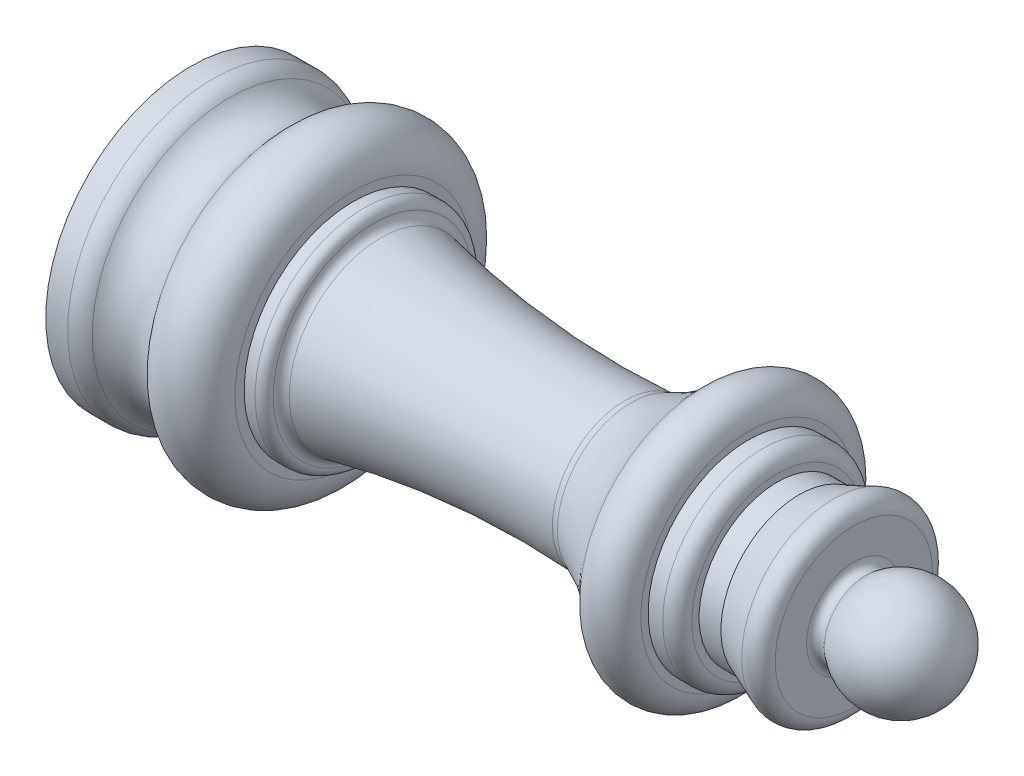
ISO-10303-21;
HEADER;
FILE_DESCRIPTION(('STEP AP214'),'2;1');
FILE_NAME('part.step','',(''),(''),'','','');
FILE_SCHEMA(('AUTOMOTIVE_DESIGN { 1 0 10303 214 1 1 1 1 }'));
ENDSEC;
DATA;
#1=APPLICATION_CONTEXT('core data for automotive mechanical design processes');
#2=APPLICATION_PROTOCOL_DEFINITION('international standard','automotive_design',2000,#1);
#3=PRODUCT_CONTEXT('',#1,'mechanical');
#4=PRODUCT('Part','Part','',(#3));
#5=PRODUCT_RELATED_PRODUCT_CATEGORY('part','',(#4));
#6=PRODUCT_DEFINITION_FORMATION('','',#4);
#7=PRODUCT_DEFINITION_CONTEXT('part definition',#1,'design');
#8=PRODUCT_DEFINITION('design','',#6,#7);
#9=PRODUCT_DEFINITION_SHAPE('','',#8);
#10=(LENGTH_UNIT() NAMED_UNIT(*) SI_UNIT(.MILLI.,.METRE.));
#11=(NAMED_UNIT(*) PLANE_ANGLE_UNIT() SI_UNIT($,.RADIAN.));
#12=(NAMED_UNIT(*) SI_UNIT($,.STERADIAN.) SOLID_ANGLE_UNIT());
#13=UNCERTAINTY_MEASURE_WITH_UNIT(LENGTH_MEASURE(1.E-05),#10,'distance_accuracy_value','');
#14=(GEOMETRIC_REPRESENTATION_CONTEXT(3) GLOBAL_UNCERTAINTY_ASSIGNED_CONTEXT((#13)) GLOBAL_UNIT_ASSIGNED_CONTEXT((#10,
#11,#12)) REPRESENTATION_CONTEXT('',''));
#15=CARTESIAN_POINT('',(0.,0.,0.));
#16=DIRECTION('',(0.,0.,1.));
#17=DIRECTION('',(1.,0.,0.));
#18=AXIS2_PLACEMENT_3D('',#15,#16,#17);
#19=CARTESIAN_POINT('',(-7.5,0.,0.));
#20=DIRECTION('',(1.,0.,0.));
#21=DIRECTION('',(0.,1.,0.));
#22=AXIS2_PLACEMENT_3D('',#19,#20,#21);
#23=SPHERICAL_SURFACE('',#22,7.5);
#24=CARTESIAN_POINT('',(-12.3529411764706,0.,0.));
#25=DIRECTION('',(1.,0.,0.));
#26=DIRECTION('',(0.,0.,-1.));
#27=AXIS2_PLACEMENT_3D('',#24,#25,#26);
#28=CIRCLE('',#27,5.71830061624223);
#29=CARTESIAN_POINT('',(-12.3529411764706,0.,-5.71830061624223));
#30=VERTEX_POINT('',#29);
#31=EDGE_CURVE('E59',#30,#30,#28,.T.);
#32=ORIENTED_EDGE('',*,*,#31,.T.);
#33=EDGE_LOOP('',(#32));
#34=FACE_BOUND('',#33,.T.);
#35=ADVANCED_FACE('F33',(#34),#23,.T.);
#36=CARTESIAN_POINT('',(-13.,0.,0.));
#37=DIRECTION('',(1.,0.,0.));
#38=DIRECTION('',(0.,0.,-1.));
#39=AXIS2_PLACEMENT_3D('',#36,#37,#38);
#40=TOROIDAL_SURFACE('',#39,6.48074069840786,1.);
#41=CARTESIAN_POINT('',(-14.,0.,0.));
#42=DIRECTION('',(1.,0.,0.));
#43=DIRECTION('',(0.,0.,-1.));
#44=AXIS2_PLACEMENT_3D('',#41,#42,#43);
#45=CIRCLE('',#44,6.48074069840786);
#46=CARTESIAN_POINT('',(-14.,0.,-6.48074069840786));
#47=VERTEX_POINT('',#46);
#48=EDGE_CURVE('E62',#47,#47,#45,.T.);
#49=ORIENTED_EDGE('',*,*,#48,.T.);
#50=EDGE_LOOP('',(#49));
#51=FACE_BOUND('',#50,.T.);
#52=ORIENTED_EDGE('',*,*,#31,.F.);
#53=EDGE_LOOP('',(#52));
#54=FACE_BOUND('',#53,.T.);
#55=ADVANCED_FACE('F125',(#51,#54),#40,.F.);
#56=CARTESIAN_POINT('',(-14.,6.48074069840786,0.));
#57=DIRECTION('',(1.,0.,0.));
#58=DIRECTION('',(0.,0.,-1.));
#59=AXIS2_PLACEMENT_3D('',#56,#57,#58);
#60=PLANE('',#59);
#61=CARTESIAN_POINT('',(-14.,0.,0.));
#62=DIRECTION('',(1.,0.,0.));
#63=DIRECTION('',(0.,0.,-1.));
#64=AXIS2_PLACEMENT_3D('',#61,#62,#63);
#65=CIRCLE('',#64,10.7959340771462);
#66=CARTESIAN_POINT('',(-14.,0.,-10.7959340771462));
#67=VERTEX_POINT('',#66);
#68=EDGE_CURVE('E48',#67,#67,#65,.T.);
#69=ORIENTED_EDGE('',*,*,#68,.T.);
#70=EDGE_LOOP('',(#69));
#71=FACE_BOUND('',#70,.T.);
#72=ORIENTED_EDGE('',*,*,#48,.F.);
#73=EDGE_LOOP('',(#72));
#74=FACE_BOUND('',#73,.T.);
#75=ADVANCED_FACE('F131',(#71,#74),#60,.T.);
#76=CARTESIAN_POINT('',(-14.,0.,0.));
#77=DIRECTION('',(1.,0.,0.));
#78=DIRECTION('',(0.,0.,-1.));
#79=AXIS2_PLACEMENT_3D('',#76,#77,#78);
#80=CONICAL_SURFACE('',#79,13.75,0.380506377112365);
#81=CARTESIAN_POINT('',(-16.7427813527082,0.,0.));
#82=DIRECTION('',(-1.,0.,0.));
#83=DIRECTION('',(0.,0.,1.));
#84=AXIS2_PLACEMENT_3D('',#81,#82,#83);
#85=CIRCLE('',#84,12.6528874589167);
#86=CARTESIAN_POINT('',(-16.7427813527082,0.,12.6528874589167));
#87=VERTEX_POINT('',#86);
#88=EDGE_CURVE('E44',#87,#87,#85,.T.);
#89=ORIENTED_EDGE('',*,*,#88,.T.);
#90=EDGE_LOOP('',(#89));
#91=FACE_BOUND('',#90,.T.);
#92=CARTESIAN_POINT('',(-21.5,0.,0.));
#93=DIRECTION('',(1.,0.,0.));
#94=DIRECTION('',(0.,0.,-1.));
#95=AXIS2_PLACEMENT_3D('',#92,#93,#94);
#96=CIRCLE('',#95,10.75);
#97=CARTESIAN_POINT('',(-21.5,0.,-10.75));
#98=VERTEX_POINT('',#97);
#99=EDGE_CURVE('E65',#98,#98,#96,.T.);
#100=ORIENTED_EDGE('',*,*,#99,.T.);
#101=EDGE_LOOP('',(#100));
#102=FACE_BOUND('',#101,.T.);
#103=ADVANCED_FACE('F147',(#91,#102),#80,.T.);
#104=CARTESIAN_POINT('',(0.,0.,0.));
#105=DIRECTION('',(1.,0.,0.));
#106=DIRECTION('',(0.,0.,-1.));
#107=AXIS2_PLACEMENT_3D('',#104,#105,#106);
#108=CYLINDRICAL_SURFACE('',#107,10.75);
#109=CARTESIAN_POINT('',(-24.5,0.,0.));
#110=DIRECTION('',(1.,0.,0.));
#111=DIRECTION('',(0.,0.,-1.));
#112=AXIS2_PLACEMENT_3D('',#109,#110,#111);
#113=CIRCLE('',#112,10.75);
#114=CARTESIAN_POINT('',(-24.5,0.,-10.75));
#115=VERTEX_POINT('',#114);
#116=EDGE_CURVE('E68',#115,#115,#113,.T.);
#117=ORIENTED_EDGE('',*,*,#116,.T.);
#118=EDGE_LOOP('',(#117));
#119=FACE_BOUND('',#118,.T.);
#120=ORIENTED_EDGE('',*,*,#99,.F.);
#121=EDGE_LOOP('',(#120));
#122=FACE_BOUND('',#121,.T.);
#123=ADVANCED_FACE('F154',(#119,#122),#108,.T.);
#124=CARTESIAN_POINT('',(-24.5,10.75,0.));
#125=DIRECTION('',(1.,0.,0.));
#126=DIRECTION('',(0.,0.,-1.));
#127=AXIS2_PLACEMENT_3D('',#124,#125,#126);
#128=PLANE('',#127);
#129=CARTESIAN_POINT('',(-24.5,0.,0.));
#130=DIRECTION('',(1.,0.,0.));
#131=DIRECTION('',(0.,0.,-1.));
#132=AXIS2_PLACEMENT_3D('',#129,#130,#131);
#133=CIRCLE('',#132,11.75);
#134=CARTESIAN_POINT('',(-24.5,0.,-11.75));
#135=VERTEX_POINT('',#134);
#136=EDGE_CURVE('E56',#135,#135,#133,.T.);
#137=ORIENTED_EDGE('',*,*,#136,.T.);
#138=EDGE_LOOP('',(#137));
#139=FACE_BOUND('',#138,.T.);
#140=ORIENTED_EDGE('',*,*,#116,.F.);
#141=EDGE_LOOP('',(#140));
#142=FACE_BOUND('',#141,.T.);
#143=ADVANCED_FACE('F160',(#139,#142),#128,.T.);
#144=CARTESIAN_POINT('',(0.,0.,0.));
#145=DIRECTION('',(1.,0.,0.));
#146=DIRECTION('',(0.,0.,-1.));
#147=AXIS2_PLACEMENT_3D('',#144,#145,#146);
#148=CYLINDRICAL_SURFACE('',#147,13.75);
#149=CARTESIAN_POINT('',(-26.5,0.,0.));
#150=DIRECTION('',(1.,0.,0.));
#151=DIRECTION('',(0.,0.,-1.));
#152=AXIS2_PLACEMENT_3D('',#149,#150,#151);
#153=CIRCLE('',#152,13.75);
#154=CARTESIAN_POINT('',(-26.5,0.,-13.75));
#155=VERTEX_POINT('',#154);
#156=EDGE_CURVE('E53',#155,#155,#153,.F.);
#157=ORIENTED_EDGE('',*,*,#156,.T.);
#158=EDGE_LOOP('',(#157));
#159=FACE_BOUND('',#158,.T.);
#160=CARTESIAN_POINT('',(-28.5,0.,0.));
#161=DIRECTION('',(1.,0.,0.));
#162=DIRECTION('',(0.,0.,-1.));
#163=AXIS2_PLACEMENT_3D('',#160,#161,#162);
#164=CIRCLE('',#163,13.75);
#165=CARTESIAN_POINT('',(-28.5,0.,-13.75));
#166=VERTEX_POINT('',#165);
#167=EDGE_CURVE('E71',#166,#166,#164,.T.);
#168=ORIENTED_EDGE('',*,*,#167,.T.);
#169=EDGE_LOOP('',(#168));
#170=FACE_BOUND('',#169,.T.);
#171=ADVANCED_FACE('F164',(#159,#170),#148,.T.);
#172=CARTESIAN_POINT('',(-28.5,13.75,0.));
#173=DIRECTION('',(1.,0.,0.));
#174=DIRECTION('',(0.,0.,-1.));
#175=AXIS2_PLACEMENT_3D('',#172,#173,#174);
#176=PLANE('',#175);
#177=CARTESIAN_POINT('',(-28.5,0.,0.));
#178=DIRECTION('',(1.,0.,0.));
#179=DIRECTION('',(0.,0.,-1.));
#180=AXIS2_PLACEMENT_3D('',#177,#178,#179);
#181=CIRCLE('',#180,14.75);
#182=CARTESIAN_POINT('',(-28.5,0.,-14.75));
#183=VERTEX_POINT('',#182);
#184=EDGE_CURVE('E74',#183,#183,#181,.T.);
#185=ORIENTED_EDGE('',*,*,#184,.T.);
#186=EDGE_LOOP('',(#185));
#187=FACE_BOUND('',#186,.T.);
#188=ORIENTED_EDGE('',*,*,#167,.F.);
#189=EDGE_LOOP('',(#188));
#190=FACE_BOUND('',#189,.T.);
#191=ADVANCED_FACE('F168',(#187,#190),#176,.T.);
#192=CARTESIAN_POINT('',(-31.9998435285759,0.,0.));
#193=DIRECTION('',(1.,0.,0.));
#194=DIRECTION('',(0.,0.,-1.));
#195=AXIS2_PLACEMENT_3D('',#192,#193,#194);
#196=TOROIDAL_SURFACE('',#195,14.7169050534756,3.49999999999999);
#197=CARTESIAN_POINT('',(-34.637471585637,0.,0.));
#198=DIRECTION('',(1.,0.,0.));
#199=DIRECTION('',(0.,0.,-1.));
#200=AXIS2_PLACEMENT_3D('',#197,#198,#199);
#201=CIRCLE('',#200,17.0175393644003);
#202=CARTESIAN_POINT('',(-34.637471585637,0.,-17.0175393644003));
#203=VERTEX_POINT('',#202);
#204=EDGE_CURVE('E77',#203,#203,#201,.T.);
#205=ORIENTED_EDGE('',*,*,#204,.T.);
#206=EDGE_LOOP('',(#205));
#207=FACE_BOUND('',#206,.T.);
#208=ORIENTED_EDGE('',*,*,#184,.F.);
#209=EDGE_LOOP('',(#208));
#210=FACE_BOUND('',#209,.T.);
#211=ADVANCED_FACE('F172',(#207,#210),#196,.T.);
#212=CARTESIAN_POINT('',(-53.1008679850651,0.,0.));
#213=DIRECTION('',(1.,0.,0.));
#214=DIRECTION('',(0.,0.,-1.));
#215=AXIS2_PLACEMENT_3D('',#212,#213,#214);
#216=TOROIDAL_SURFACE('',#215,33.1219795408729,24.5);
#217=CARTESIAN_POINT('',(-44.5676192443092,0.,0.));
#218=DIRECTION('',(-1.,0.,0.));
#219=DIRECTION('',(0.,0.,1.));
#220=AXIS2_PLACEMENT_3D('',#217,#218,#219);
#221=CIRCLE('',#220,10.156055524444);
#222=CARTESIAN_POINT('',(-44.5676192443092,0.,10.156055524444));
#223=VERTEX_POINT('',#222);
#224=EDGE_CURVE('E40',#223,#223,#221,.F.);
#225=ORIENTED_EDGE('',*,*,#224,.T.);
#226=EDGE_LOOP('',(#225));
#227=FACE_BOUND('',#226,.T.);
#228=ORIENTED_EDGE('',*,*,#204,.F.);
#229=EDGE_LOOP('',(#228));
#230=FACE_BOUND('',#229,.T.);
#231=ADVANCED_FACE('F176',(#227,#230),#216,.F.);
#232=CARTESIAN_POINT('',(-52.8281884760566,0.,0.));
#233=DIRECTION('',(1.,0.,0.));
#234=DIRECTION('',(0.,0.,-1.));
#235=AXIS2_PLACEMENT_3D('',#232,#233,#234);
#236=TOROIDAL_SURFACE('',#235,134.754637048822,125.);
#237=CARTESIAN_POINT('',(-45.4350720510171,0.,0.));
#238=DIRECTION('',(-1.,0.,0.));
#239=DIRECTION('',(0.,0.,1.));
#240=AXIS2_PLACEMENT_3D('',#237,#238,#239);
#241=CIRCLE('',#240,9.97346126687247);
#242=CARTESIAN_POINT('',(-45.4350720510171,0.,9.97346126687247));
#243=VERTEX_POINT('',#242);
#244=EDGE_CURVE('E10',#243,#243,#241,.T.);
#245=ORIENTED_EDGE('',*,*,#244,.T.);
#246=EDGE_LOOP('',(#245));
#247=FACE_BOUND('',#246,.T.);
#248=CARTESIAN_POINT('',(-79.0118364800399,0.,0.));
#249=DIRECTION('',(1.,0.,0.));
#250=DIRECTION('',(0.,0.,-1.));
#251=AXIS2_PLACEMENT_3D('',#248,#249,#250);
#252=CIRCLE('',#251,12.5277309389008);
#253=CARTESIAN_POINT('',(-79.0118364800399,0.,-12.5277309389008));
#254=VERTEX_POINT('',#253);
#255=EDGE_CURVE('E80',#254,#254,#252,.T.);
#256=ORIENTED_EDGE('',*,*,#255,.T.);
#257=EDGE_LOOP('',(#256));
#258=FACE_BOUND('',#257,.T.);
#259=ADVANCED_FACE('F180',(#247,#258),#236,.F.);
#260=CARTESIAN_POINT('',(-78.7500000000001,0.,0.));
#261=DIRECTION('',(1.,0.,0.));
#262=DIRECTION('',(0.,0.,-1.));
#263=AXIS2_PLACEMENT_3D('',#260,#261,#262);
#264=TOROIDAL_SURFACE('',#263,13.75,1.24999999999995);
#265=CARTESIAN_POINT('',(-80.0000000000001,0.,0.));
#266=DIRECTION('',(1.,0.,0.));
#267=DIRECTION('',(0.,0.,-1.));
#268=AXIS2_PLACEMENT_3D('',#265,#266,#267);
#269=CIRCLE('',#268,13.75);
#270=CARTESIAN_POINT('',(-80.0000000000001,0.,-13.75));
#271=VERTEX_POINT('',#270);
#272=EDGE_CURVE('E83',#271,#271,#269,.T.);
#273=ORIENTED_EDGE('',*,*,#272,.T.);
#274=EDGE_LOOP('',(#273));
#275=FACE_BOUND('',#274,.T.);
#276=ORIENTED_EDGE('',*,*,#255,.F.);
#277=EDGE_LOOP('',(#276));
#278=FACE_BOUND('',#277,.T.);
#279=ADVANCED_FACE('F183',(#275,#278),#264,.F.);
#280=CARTESIAN_POINT('',(-81.2500000000001,0.,0.));
#281=DIRECTION('',(1.,0.,0.));
#282=DIRECTION('',(0.,0.,-1.));
#283=AXIS2_PLACEMENT_3D('',#280,#281,#282);
#284=TOROIDAL_SURFACE('',#283,13.75,1.25);
#285=CARTESIAN_POINT('',(-81.2500000000001,0.,0.));
#286=DIRECTION('',(1.,0.,0.));
#287=DIRECTION('',(0.,0.,-1.));
#288=AXIS2_PLACEMENT_3D('',#285,#286,#287);
#289=CIRCLE('',#288,15.);
#290=CARTESIAN_POINT('',(-81.2500000000001,0.,-15.));
#291=VERTEX_POINT('',#290);
#292=EDGE_CURVE('E86',#291,#291,#289,.T.);
#293=ORIENTED_EDGE('',*,*,#292,.T.);
#294=EDGE_LOOP('',(#293));
#295=FACE_BOUND('',#294,.T.);
#296=ORIENTED_EDGE('',*,*,#272,.F.);
#297=EDGE_LOOP('',(#296));
#298=FACE_BOUND('',#297,.T.);
#299=ADVANCED_FACE('F186',(#295,#298),#284,.T.);
#300=CARTESIAN_POINT('',(0.,0.,0.));
#301=DIRECTION('',(1.,0.,0.));
#302=DIRECTION('',(0.,0.,-1.));
#303=AXIS2_PLACEMENT_3D('',#300,#301,#302);
#304=CYLINDRICAL_SURFACE('',#303,15.);
#305=CARTESIAN_POINT('',(-82.7500000000001,0.,0.));
#306=DIRECTION('',(1.,0.,0.));
#307=DIRECTION('',(0.,0.,-1.));
#308=AXIS2_PLACEMENT_3D('',#305,#306,#307);
#309=CIRCLE('',#308,15.);
#310=CARTESIAN_POINT('',(-82.7500000000001,0.,-15.));
#311=VERTEX_POINT('',#310);
#312=EDGE_CURVE('E89',#311,#311,#309,.T.);
#313=ORIENTED_EDGE('',*,*,#312,.T.);
#314=EDGE_LOOP('',(#313));
#315=FACE_BOUND('',#314,.T.);
#316=ORIENTED_EDGE('',*,*,#292,.F.);
#317=EDGE_LOOP('',(#316));
#318=FACE_BOUND('',#317,.T.);
#319=ADVANCED_FACE('F190',(#315,#318),#304,.T.);
#320=CARTESIAN_POINT('',(-82.7500000000001,15.,0.));
#321=DIRECTION('',(1.,0.,0.));
#322=DIRECTION('',(0.,0.,-1.));
#323=AXIS2_PLACEMENT_3D('',#320,#321,#322);
#324=PLANE('',#323);
#325=CARTESIAN_POINT('',(-82.7500000000001,0.,0.));
#326=DIRECTION('',(1.,0.,0.));
#327=DIRECTION('',(0.,0.,-1.));
#328=AXIS2_PLACEMENT_3D('',#325,#326,#327);
#329=CIRCLE('',#328,16.25);
#330=CARTESIAN_POINT('',(-82.7500000000001,0.,-16.25));
#331=VERTEX_POINT('',#330);
#332=EDGE_CURVE('E92',#331,#331,#329,.T.);
#333=ORIENTED_EDGE('',*,*,#332,.T.);
#334=EDGE_LOOP('',(#333));
#335=FACE_BOUND('',#334,.T.);
#336=ORIENTED_EDGE('',*,*,#312,.F.);
#337=EDGE_LOOP('',(#336));
#338=FACE_BOUND('',#337,.T.);
#339=ADVANCED_FACE('F194',(#335,#338),#324,.T.);
#340=CARTESIAN_POINT('',(-87.7500000000001,0.,0.));
#341=DIRECTION('',(1.,0.,0.));
#342=DIRECTION('',(0.,0.,-1.));
#343=AXIS2_PLACEMENT_3D('',#340,#341,#342);
#344=TOROIDAL_SURFACE('',#343,16.25,5.);
#345=CARTESIAN_POINT('',(-91.7995942301947,0.,0.));
#346=DIRECTION('',(1.,0.,0.));
#347=DIRECTION('',(0.,0.,-1.));
#348=AXIS2_PLACEMENT_3D('',#345,#346,#347);
#349=CIRCLE('',#348,19.1827097658606);
#350=CARTESIAN_POINT('',(-91.7995942301947,0.,-19.1827097658606));
#351=VERTEX_POINT('',#350);
#352=EDGE_CURVE('E95',#351,#351,#349,.T.);
#353=ORIENTED_EDGE('',*,*,#352,.T.);
#354=EDGE_LOOP('',(#353));
#355=FACE_BOUND('',#354,.T.);
#356=ORIENTED_EDGE('',*,*,#332,.F.);
#357=EDGE_LOOP('',(#356));
#358=FACE_BOUND('',#357,.T.);
#359=ADVANCED_FACE('F198',(#355,#358),#344,.T.);
#360=CARTESIAN_POINT('',(-95.8491884603894,0.,0.));
#361=DIRECTION('',(1.,0.,0.));
#362=DIRECTION('',(0.,0.,-1.));
#363=AXIS2_PLACEMENT_3D('',#360,#361,#362);
#364=TOROIDAL_SURFACE('',#363,22.1154195317212,5.);
#365=CARTESIAN_POINT('',(-99.6934457075192,0.,0.));
#366=DIRECTION('',(1.,0.,0.));
#367=DIRECTION('',(0.,0.,-1.));
#368=AXIS2_PLACEMENT_3D('',#365,#366,#367);
#369=CIRCLE('',#368,18.9182823407501);
#370=CARTESIAN_POINT('',(-99.6934457075192,0.,-18.9182823407501));
#371=VERTEX_POINT('',#370);
#372=EDGE_CURVE('E98',#371,#371,#369,.T.);
#373=ORIENTED_EDGE('',*,*,#372,.T.);
#374=EDGE_LOOP('',(#373));
#375=FACE_BOUND('',#374,.T.);
#376=ORIENTED_EDGE('',*,*,#352,.F.);
#377=EDGE_LOOP('',(#376));
#378=FACE_BOUND('',#377,.T.);
#379=ADVANCED_FACE('F202',(#375,#378),#364,.F.);
#380=CARTESIAN_POINT('',(-102.,0.,0.));
#381=DIRECTION('',(1.,0.,0.));
#382=DIRECTION('',(0.,0.,-1.));
#383=AXIS2_PLACEMENT_3D('',#380,#381,#382);
#384=TOROIDAL_SURFACE('',#383,17.0000000725719,2.99999992742809);
#385=CARTESIAN_POINT('',(-102.,0.,0.));
#386=DIRECTION('',(1.,0.,0.));
#387=DIRECTION('',(0.,0.,-1.));
#388=AXIS2_PLACEMENT_3D('',#385,#386,#387);
#389=CIRCLE('',#388,20.);
#390=CARTESIAN_POINT('',(-102.,0.,-20.));
#391=VERTEX_POINT('',#390);
#392=EDGE_CURVE('E101',#391,#391,#389,.T.);
#393=ORIENTED_EDGE('',*,*,#392,.T.);
#394=EDGE_LOOP('',(#393));
#395=FACE_BOUND('',#394,.T.);
#396=ORIENTED_EDGE('',*,*,#372,.F.);
#397=EDGE_LOOP('',(#396));
#398=FACE_BOUND('',#397,.T.);
#399=ADVANCED_FACE('F122',(#395,#398),#384,.T.);
#400=CARTESIAN_POINT('',(0.,0.,0.));
#401=DIRECTION('',(1.,0.,0.));
#402=DIRECTION('',(0.,0.,-1.));
#403=AXIS2_PLACEMENT_3D('',#400,#401,#402);
#404=CYLINDRICAL_SURFACE('',#403,20.);
#405=CARTESIAN_POINT('',(-105.,0.,0.));
#406=DIRECTION('',(1.,0.,0.));
#407=DIRECTION('',(0.,0.,-1.));
#408=AXIS2_PLACEMENT_3D('',#405,#406,#407);
#409=CIRCLE('',#408,20.);
#410=CARTESIAN_POINT('',(-105.,0.,-20.));
#411=VERTEX_POINT('',#410);
#412=EDGE_CURVE('E104',#411,#411,#409,.T.);
#413=ORIENTED_EDGE('',*,*,#412,.T.);
#414=EDGE_LOOP('',(#413));
#415=FACE_BOUND('',#414,.T.);
#416=ORIENTED_EDGE('',*,*,#392,.F.);
#417=EDGE_LOOP('',(#416));
#418=FACE_BOUND('',#417,.T.);
#419=ADVANCED_FACE('F108',(#415,#418),#404,.T.);
#420=CARTESIAN_POINT('',(-105.,0.,0.));
#421=DIRECTION('',(-1.,0.,0.));
#422=DIRECTION('',(0.,0.,1.));
#423=AXIS2_PLACEMENT_3D('',#420,#421,#422);
#424=PLANE('',#423);
#425=ORIENTED_EDGE('',*,*,#412,.F.);
#426=EDGE_LOOP('',(#425));
#427=FACE_BOUND('',#426,.T.);
#428=ADVANCED_FACE('F111',(#427),#424,.T.);
#429=CARTESIAN_POINT('',(-26.5,0.,0.));
#430=DIRECTION('',(1.,0.,0.));
#431=DIRECTION('',(0.,0.,-1.));
#432=AXIS2_PLACEMENT_3D('',#429,#430,#431);
#433=TOROIDAL_SURFACE('',#432,11.75,2.);
#434=ORIENTED_EDGE('',*,*,#156,.F.);
#435=EDGE_LOOP('',(#434));
#436=FACE_BOUND('',#435,.T.);
#437=ORIENTED_EDGE('',*,*,#136,.F.);
#438=EDGE_LOOP('',(#437));
#439=FACE_BOUND('',#438,.T.);
#440=ADVANCED_FACE('F113',(#436,#439),#433,.T.);
#441=CARTESIAN_POINT('',(-16.,0.,0.));
#442=DIRECTION('',(1.,0.,0.));
#443=DIRECTION('',(0.,0.,-1.));
#444=AXIS2_PLACEMENT_3D('',#441,#442,#443);
#445=TOROIDAL_SURFACE('',#444,10.7959340771462,2.);
#446=ORIENTED_EDGE('',*,*,#88,.F.);
#447=EDGE_LOOP('',(#446));
#448=FACE_BOUND('',#447,.T.);
#449=ORIENTED_EDGE('',*,*,#68,.F.);
#450=EDGE_LOOP('',(#449));
#451=FACE_BOUND('',#450,.T.);
#452=ADVANCED_FACE('F119',(#448,#451),#445,.T.);
#453=CARTESIAN_POINT('',(-45.6125068452181,0.,0.));
#454=DIRECTION('',(1.,0.,0.));
#455=DIRECTION('',(0.,0.,-1.));
#456=AXIS2_PLACEMENT_3D('',#453,#454,#455);
#457=TOROIDAL_SURFACE('',#456,12.9682094856393,3.);
#458=ORIENTED_EDGE('',*,*,#244,.F.);
#459=EDGE_LOOP('',(#458));
#460=FACE_BOUND('',#459,.T.);
#461=ORIENTED_EDGE('',*,*,#224,.F.);
#462=EDGE_LOOP('',(#461));
#463=FACE_BOUND('',#462,.T.);
#464=ADVANCED_FACE('F35',(#460,#463),#457,.F.);
#465=CLOSED_SHELL('',(#35,#55,#75,#103,#123,#143,#171,#191,#211,#231,#259,#279,#299,#319,#339,
#359,#379,#399,#419,#428,#440,#452,#464));
#466=MANIFOLD_SOLID_BREP('B2',#465);
#467=ADVANCED_BREP_SHAPE_REPRESENTATION('',(#18,#466),#14);
#468=SHAPE_DEFINITION_REPRESENTATION(#9,#467);
ENDSEC;
END-ISO-10303-21;
